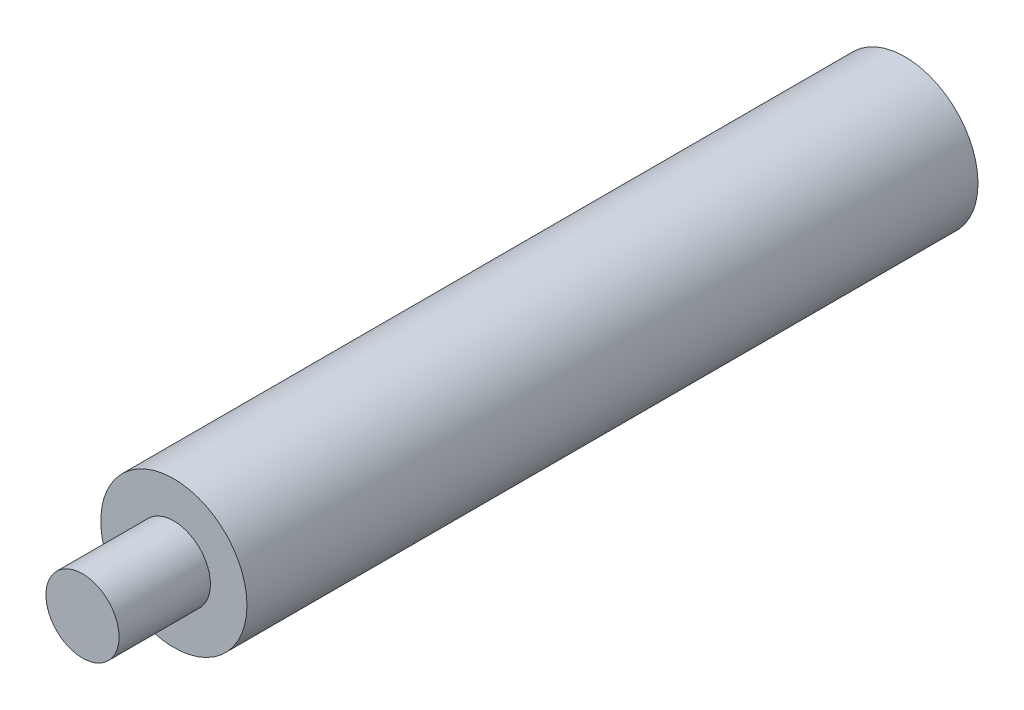
ISO-10303-21;
HEADER;
FILE_DESCRIPTION(('STEP AP214'),'2;1');
FILE_NAME('part.step','',(''),(''),'','','');
FILE_SCHEMA(('AUTOMOTIVE_DESIGN { 1 0 10303 214 1 1 1 1 }'));
ENDSEC;
DATA;
#1=APPLICATION_CONTEXT('core data for automotive mechanical design processes');
#2=APPLICATION_PROTOCOL_DEFINITION('international standard','automotive_design',2000,#1);
#3=PRODUCT_CONTEXT('',#1,'mechanical');
#4=PRODUCT('Part','Part','',(#3));
#5=PRODUCT_RELATED_PRODUCT_CATEGORY('part','',(#4));
#6=PRODUCT_DEFINITION_FORMATION('','',#4);
#7=PRODUCT_DEFINITION_CONTEXT('part definition',#1,'design');
#8=PRODUCT_DEFINITION('design','',#6,#7);
#9=PRODUCT_DEFINITION_SHAPE('','',#8);
#10=(LENGTH_UNIT() NAMED_UNIT(*) SI_UNIT(.MILLI.,.METRE.));
#11=(NAMED_UNIT(*) PLANE_ANGLE_UNIT() SI_UNIT($,.RADIAN.));
#12=(NAMED_UNIT(*) SI_UNIT($,.STERADIAN.) SOLID_ANGLE_UNIT());
#13=UNCERTAINTY_MEASURE_WITH_UNIT(LENGTH_MEASURE(1.E-05),#10,'distance_accuracy_value','');
#14=(GEOMETRIC_REPRESENTATION_CONTEXT(3) GLOBAL_UNCERTAINTY_ASSIGNED_CONTEXT((#13)) GLOBAL_UNIT_ASSIGNED_CONTEXT((#10,
#11,#12)) REPRESENTATION_CONTEXT('',''));
#15=CARTESIAN_POINT('',(0.,0.,0.));
#16=DIRECTION('',(0.,0.,1.));
#17=DIRECTION('',(1.,0.,0.));
#18=AXIS2_PLACEMENT_3D('',#15,#16,#17);
#19=CARTESIAN_POINT('',(0.,0.,400.));
#20=DIRECTION('',(0.,0.,-1.));
#21=DIRECTION('',(-1.,0.,0.));
#22=AXIS2_PLACEMENT_3D('',#19,#20,#21);
#23=CYLINDRICAL_SURFACE('',#22,40.);
#24=CARTESIAN_POINT('',(0.,0.,400.));
#25=DIRECTION('',(0.,0.,1.));
#26=DIRECTION('',(1.,0.,0.));
#27=AXIS2_PLACEMENT_3D('',#24,#25,#26);
#28=CIRCLE('',#27,40.);
#29=CARTESIAN_POINT('',(40.,0.,400.));
#30=VERTEX_POINT('',#29);
#31=EDGE_CURVE('E37',#30,#30,#28,.T.);
#32=ORIENTED_EDGE('',*,*,#31,.F.);
#33=EDGE_LOOP('',(#32));
#34=FACE_BOUND('',#33,.T.);
#35=CARTESIAN_POINT('',(0.,0.,0.));
#36=DIRECTION('',(0.,0.,1.));
#37=DIRECTION('',(1.,0.,0.));
#38=AXIS2_PLACEMENT_3D('',#35,#36,#37);
#39=CIRCLE('',#38,40.);
#40=CARTESIAN_POINT('',(40.,0.,0.));
#41=VERTEX_POINT('',#40);
#42=EDGE_CURVE('E33',#41,#41,#39,.T.);
#43=ORIENTED_EDGE('',*,*,#42,.T.);
#44=EDGE_LOOP('',(#43));
#45=FACE_BOUND('',#44,.T.);
#46=ADVANCED_FACE('F30',(#34,#45),#23,.T.);
#47=CARTESIAN_POINT('',(0.,0.,400.));
#48=DIRECTION('',(0.,0.,1.));
#49=DIRECTION('',(1.,0.,0.));
#50=AXIS2_PLACEMENT_3D('',#47,#48,#49);
#51=PLANE('',#50);
#52=CARTESIAN_POINT('',(0.,0.,400.));
#53=DIRECTION('',(0.,0.,1.));
#54=DIRECTION('',(1.,0.,0.));
#55=AXIS2_PLACEMENT_3D('',#52,#53,#54);
#56=CIRCLE('',#55,20.);
#57=CARTESIAN_POINT('',(20.,0.,400.));
#58=VERTEX_POINT('',#57);
#59=EDGE_CURVE('E10',#58,#58,#56,.T.);
#60=ORIENTED_EDGE('',*,*,#59,.F.);
#61=EDGE_LOOP('',(#60));
#62=FACE_BOUND('',#61,.T.);
#63=ORIENTED_EDGE('',*,*,#31,.T.);
#64=EDGE_LOOP('',(#63));
#65=FACE_BOUND('',#64,.T.);
#66=ADVANCED_FACE('F54',(#62,#65),#51,.T.);
#67=CARTESIAN_POINT('',(0.,0.,0.));
#68=DIRECTION('',(0.,0.,1.));
#69=DIRECTION('',(1.,0.,0.));
#70=AXIS2_PLACEMENT_3D('',#67,#68,#69);
#71=PLANE('',#70);
#72=ORIENTED_EDGE('',*,*,#42,.F.);
#73=EDGE_LOOP('',(#72));
#74=FACE_BOUND('',#73,.T.);
#75=ADVANCED_FACE('F51',(#74),#71,.F.);
#76=CARTESIAN_POINT('',(0.,0.,450.));
#77=DIRECTION('',(0.,0.,-1.));
#78=DIRECTION('',(-1.,0.,0.));
#79=AXIS2_PLACEMENT_3D('',#76,#77,#78);
#80=CYLINDRICAL_SURFACE('',#79,20.);
#81=CARTESIAN_POINT('',(0.,0.,450.));
#82=DIRECTION('',(0.,0.,1.));
#83=DIRECTION('',(1.,0.,0.));
#84=AXIS2_PLACEMENT_3D('',#81,#82,#83);
#85=CIRCLE('',#84,20.);
#86=CARTESIAN_POINT('',(20.,0.,450.));
#87=VERTEX_POINT('',#86);
#88=EDGE_CURVE('E43',#87,#87,#85,.T.);
#89=ORIENTED_EDGE('',*,*,#88,.F.);
#90=EDGE_LOOP('',(#89));
#91=FACE_BOUND('',#90,.T.);
#92=ORIENTED_EDGE('',*,*,#59,.T.);
#93=EDGE_LOOP('',(#92));
#94=FACE_BOUND('',#93,.T.);
#95=ADVANCED_FACE('F53',(#91,#94),#80,.T.);
#96=CARTESIAN_POINT('',(0.,0.,450.));
#97=DIRECTION('',(0.,0.,1.));
#98=DIRECTION('',(1.,0.,0.));
#99=AXIS2_PLACEMENT_3D('',#96,#97,#98);
#100=PLANE('',#99);
#101=ORIENTED_EDGE('',*,*,#88,.T.);
#102=EDGE_LOOP('',(#101));
#103=FACE_BOUND('',#102,.T.);
#104=ADVANCED_FACE('F59',(#103),#100,.T.);
#105=CLOSED_SHELL('',(#46,#66,#75,#95,#104));
#106=MANIFOLD_SOLID_BREP('B2',#105);
#107=ADVANCED_BREP_SHAPE_REPRESENTATION('',(#18,#106),#14);
#108=SHAPE_DEFINITION_REPRESENTATION(#9,#107);
ENDSEC;
END-ISO-10303-21;
